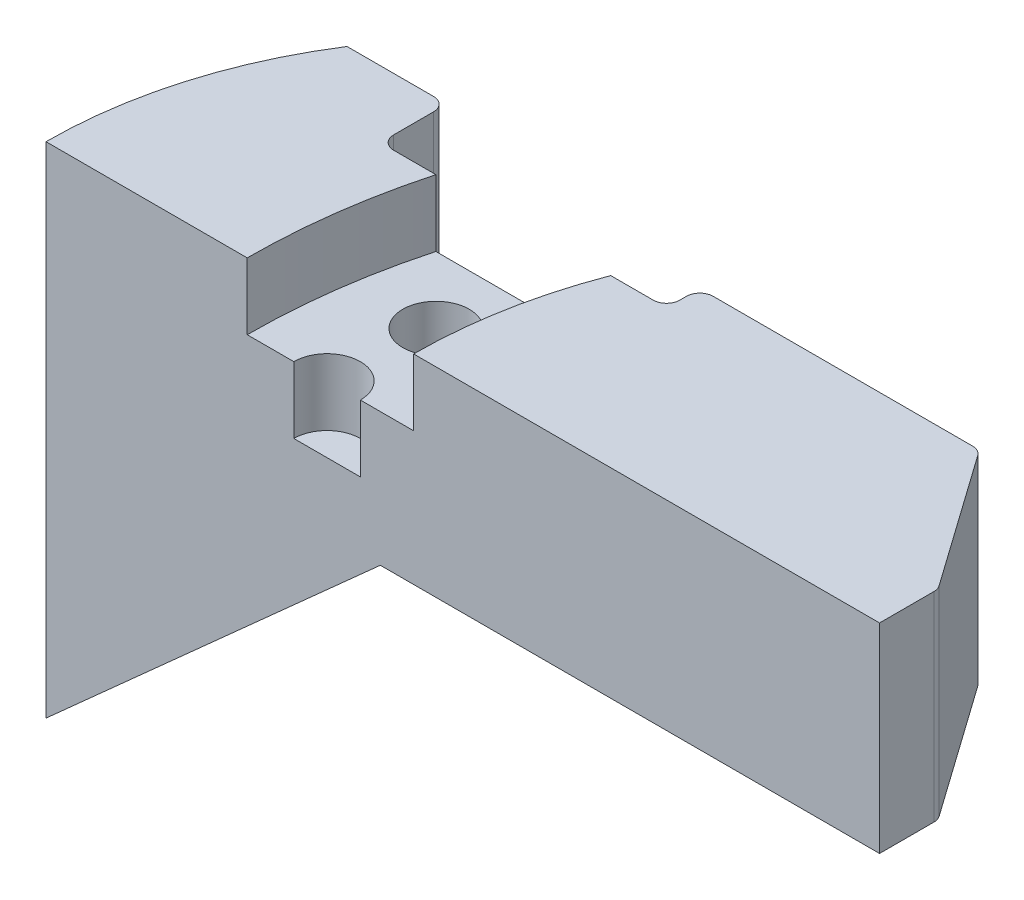
ISO-10303-21;
HEADER;
FILE_DESCRIPTION(('STEP AP214'),'2;1');
FILE_NAME('part.step','',(''),(''),'','','');
FILE_SCHEMA(('AUTOMOTIVE_DESIGN { 1 0 10303 214 1 1 1 1 }'));
ENDSEC;
DATA;
#1=APPLICATION_CONTEXT('core data for automotive mechanical design processes');
#2=APPLICATION_PROTOCOL_DEFINITION('international standard','automotive_design',2000,#1);
#3=PRODUCT_CONTEXT('',#1,'mechanical');
#4=PRODUCT('Part','Part','',(#3));
#5=PRODUCT_RELATED_PRODUCT_CATEGORY('part','',(#4));
#6=PRODUCT_DEFINITION_FORMATION('','',#4);
#7=PRODUCT_DEFINITION_CONTEXT('part definition',#1,'design');
#8=PRODUCT_DEFINITION('design','',#6,#7);
#9=PRODUCT_DEFINITION_SHAPE('','',#8);
#10=(LENGTH_UNIT() NAMED_UNIT(*) SI_UNIT(.MILLI.,.METRE.));
#11=(NAMED_UNIT(*) PLANE_ANGLE_UNIT() SI_UNIT($,.RADIAN.));
#12=(NAMED_UNIT(*) SI_UNIT($,.STERADIAN.) SOLID_ANGLE_UNIT());
#13=UNCERTAINTY_MEASURE_WITH_UNIT(LENGTH_MEASURE(1.E-05),#10,'distance_accuracy_value','');
#14=(GEOMETRIC_REPRESENTATION_CONTEXT(3) GLOBAL_UNCERTAINTY_ASSIGNED_CONTEXT((#13)) GLOBAL_UNIT_ASSIGNED_CONTEXT((#10,
#11,#12)) REPRESENTATION_CONTEXT('',''));
#15=CARTESIAN_POINT('',(0.,0.,0.));
#16=DIRECTION('',(0.,0.,1.));
#17=DIRECTION('',(1.,0.,0.));
#18=AXIS2_PLACEMENT_3D('',#15,#16,#17);
#19=CARTESIAN_POINT('',(-45.,75.,-33.));
#20=DIRECTION('',(0.,1.,0.));
#21=DIRECTION('',(0.,0.,1.));
#22=AXIS2_PLACEMENT_3D('',#19,#20,#21);
#23=PLANE('',#22);
#24=DIRECTION('',(-1.,0.,0.));
#25=VECTOR('',#24,1.);
#26=CARTESIAN_POINT('',(-2.00000000000001,75.,-25.));
#27=LINE('',#26,#25);
#28=CARTESIAN_POINT('',(-2.00000000000001,75.,-25.));
#29=VERTEX_POINT('',#28);
#30=CARTESIAN_POINT('',(-8.38348415311009,75.,-25.));
#31=VERTEX_POINT('',#30);
#32=EDGE_CURVE('E331',#29,#31,#27,.T.);
#33=ORIENTED_EDGE('',*,*,#32,.T.);
#34=CARTESIAN_POINT('',(57.,75.,0.));
#35=DIRECTION('',(0.,1.,0.));
#36=DIRECTION('',(0.,0.,1.));
#37=AXIS2_PLACEMENT_3D('',#34,#35,#36);
#38=CIRCLE('',#37,70.);
#39=CARTESIAN_POINT('',(-13.,75.,0.));
#40=VERTEX_POINT('',#39);
#41=EDGE_CURVE('E285',#31,#40,#38,.T.);
#42=ORIENTED_EDGE('',*,*,#41,.T.);
#43=DIRECTION('',(1.,0.,0.));
#44=VECTOR('',#43,1.);
#45=CARTESIAN_POINT('',(-58.,75.,0.));
#46=LINE('',#45,#44);
#47=CARTESIAN_POINT('',(57.,75.,0.));
#48=VERTEX_POINT('',#47);
#49=EDGE_CURVE('E312',#40,#48,#46,.T.);
#50=ORIENTED_EDGE('',*,*,#49,.T.);
#51=DIRECTION('',(0.,0.,-1.));
#52=VECTOR('',#51,1.);
#53=CARTESIAN_POINT('',(57.,75.,0.));
#54=LINE('',#53,#52);
#55=CARTESIAN_POINT('',(57.,75.,-8.15891819445376));
#56=VERTEX_POINT('',#55);
#57=EDGE_CURVE('E229',#48,#56,#54,.T.);
#58=ORIENTED_EDGE('',*,*,#57,.T.);
#59=CARTESIAN_POINT('',(55.,75.,-8.15891819445377));
#60=DIRECTION('',(0.,1.,0.));
#61=DIRECTION('',(0.,0.,1.));
#62=AXIS2_PLACEMENT_3D('',#59,#60,#61);
#63=CIRCLE('',#62,2.);
#64=CARTESIAN_POINT('',(56.6327880172232,75.,-9.31390879649877));
#65=VERTEX_POINT('',#64);
#66=EDGE_CURVE('E316',#56,#65,#63,.T.);
#67=ORIENTED_EDGE('',*,*,#66,.T.);
#68=DIRECTION('',(-0.577495301022498,0.,-0.81639400861161));
#69=VECTOR('',#68,1.);
#70=CARTESIAN_POINT('',(56.6327880172232,75.,-9.31390879649877));
#71=LINE('',#70,#69);
#72=CARTESIAN_POINT('',(42.5977370626087,75.,-29.154990602045));
#73=VERTEX_POINT('',#72);
#74=EDGE_CURVE('E318',#65,#73,#71,.T.);
#75=ORIENTED_EDGE('',*,*,#74,.T.);
#76=CARTESIAN_POINT('',(40.9649490453855,75.,-28.));
#77=DIRECTION('',(0.,1.,0.));
#78=DIRECTION('',(0.,0.,1.));
#79=AXIS2_PLACEMENT_3D('',#76,#77,#78);
#80=CIRCLE('',#79,2.);
#81=CARTESIAN_POINT('',(40.9649490453855,75.,-30.));
#82=VERTEX_POINT('',#81);
#83=EDGE_CURVE('E320',#73,#82,#80,.T.);
#84=ORIENTED_EDGE('',*,*,#83,.T.);
#85=DIRECTION('',(-1.,0.,0.));
#86=VECTOR('',#85,1.);
#87=CARTESIAN_POINT('',(40.9649490453855,75.,-30.));
#88=LINE('',#87,#86);
#89=CARTESIAN_POINT('',(2.00000000000001,75.,-30.));
#90=VERTEX_POINT('',#89);
#91=EDGE_CURVE('E322',#82,#90,#88,.T.);
#92=ORIENTED_EDGE('',*,*,#91,.T.);
#93=CARTESIAN_POINT('',(2.,75.,-28.));
#94=DIRECTION('',(0.,1.,0.));
#95=DIRECTION('',(0.,0.,1.));
#96=AXIS2_PLACEMENT_3D('',#93,#94,#95);
#97=CIRCLE('',#96,2.);
#98=CARTESIAN_POINT('',(0.,75.,-28.));
#99=VERTEX_POINT('',#98);
#100=EDGE_CURVE('E324',#90,#99,#97,.T.);
#101=ORIENTED_EDGE('',*,*,#100,.T.);
#102=DIRECTION('',(0.,0.,1.));
#103=VECTOR('',#102,1.);
#104=CARTESIAN_POINT('',(0.,75.,-28.));
#105=LINE('',#104,#103);
#106=CARTESIAN_POINT('',(0.,75.,-27.));
#107=VERTEX_POINT('',#106);
#108=EDGE_CURVE('E326',#99,#107,#105,.T.);
#109=ORIENTED_EDGE('',*,*,#108,.T.);
#110=CARTESIAN_POINT('',(-2.,75.,-27.));
#111=DIRECTION('',(0.,-1.,0.));
#112=DIRECTION('',(0.,0.,1.));
#113=AXIS2_PLACEMENT_3D('',#110,#111,#112);
#114=CIRCLE('',#113,2.);
#115=EDGE_CURVE('E328',#107,#29,#114,.T.);
#116=ORIENTED_EDGE('',*,*,#115,.T.);
#117=EDGE_LOOP('',(#33,#42,#50,#58,#67,#75,#84,#92,#101,#109,#116));
#118=FACE_BOUND('',#117,.T.);
#119=ADVANCED_FACE('F53',(#118),#23,.T.);
#120=CARTESIAN_POINT('',(-45.,75.,-33.));
#121=DIRECTION('',(0.,-1.,0.));
#122=DIRECTION('',(0.,0.,-1.));
#123=AXIS2_PLACEMENT_3D('',#120,#121,#122);
#124=CYLINDRICAL_SURFACE('',#123,2.);
#125=DIRECTION('',(0.,-1.,0.));
#126=VECTOR('',#125,1.);
#127=CARTESIAN_POINT('',(-43.,75.,-33.));
#128=LINE('',#127,#126);
#129=CARTESIAN_POINT('',(-43.,75.,-33.));
#130=VERTEX_POINT('',#129);
#131=CARTESIAN_POINT('',(-43.,22.6020202218902,-33.));
#132=VERTEX_POINT('',#131);
#133=EDGE_CURVE('E338',#130,#132,#128,.T.);
#134=ORIENTED_EDGE('',*,*,#133,.T.);
#135=CARTESIAN_POINT('',(-45.,20.8101818396414,-33.));
#136=DIRECTION('',(-0.667283797428639,0.744803553757106,0.));
#137=DIRECTION('',(-0.744803553757106,-0.667283797428639,0.));
#138=AXIS2_PLACEMENT_3D('',#135,#136,#137);
#139=ELLIPSE('',#138,2.68527182759957,2.);
#140=CARTESIAN_POINT('',(-45.,20.8101818396414,-35.));
#141=VERTEX_POINT('',#140);
#142=EDGE_CURVE('E409',#132,#141,#139,.T.);
#143=ORIENTED_EDGE('',*,*,#142,.T.);
#144=DIRECTION('',(0.,-1.,0.));
#145=VECTOR('',#144,1.);
#146=CARTESIAN_POINT('',(-45.,75.,-35.));
#147=LINE('',#146,#145);
#148=CARTESIAN_POINT('',(-45.,75.,-35.));
#149=VERTEX_POINT('',#148);
#150=EDGE_CURVE('E234',#149,#141,#147,.T.);
#151=ORIENTED_EDGE('',*,*,#150,.F.);
#152=CARTESIAN_POINT('',(-45.,75.,-33.));
#153=DIRECTION('',(0.,1.,0.));
#154=DIRECTION('',(0.,0.,1.));
#155=AXIS2_PLACEMENT_3D('',#152,#153,#154);
#156=CIRCLE('',#155,2.);
#157=EDGE_CURVE('E307',#130,#149,#156,.T.);
#158=ORIENTED_EDGE('',*,*,#157,.F.);
#159=EDGE_LOOP('',(#134,#143,#151,#158));
#160=FACE_BOUND('',#159,.T.);
#161=ADVANCED_FACE('F55',(#160),#124,.T.);
#162=CARTESIAN_POINT('',(-45.,75.,-35.));
#163=DIRECTION('',(0.,0.,1.));
#164=DIRECTION('',(1.,0.,0.));
#165=AXIS2_PLACEMENT_3D('',#162,#163,#164);
#166=PLANE('',#165);
#167=ORIENTED_EDGE('',*,*,#150,.T.);
#168=DIRECTION('',(-0.744803553757106,-0.667283797428639,0.));
#169=VECTOR('',#168,1.);
#170=CARTESIAN_POINT('',(-68.2277442494834,0.,-35.));
#171=LINE('',#170,#169);
#172=CARTESIAN_POINT('',(-58.,9.16323235502432,-35.));
#173=VERTEX_POINT('',#172);
#174=EDGE_CURVE('E217',#141,#173,#171,.T.);
#175=ORIENTED_EDGE('',*,*,#174,.T.);
#176=DIRECTION('',(0.,-1.,0.));
#177=VECTOR('',#176,1.);
#178=CARTESIAN_POINT('',(-58.,75.,-35.));
#179=LINE('',#178,#177);
#180=CARTESIAN_POINT('',(-58.,75.,-35.));
#181=VERTEX_POINT('',#180);
#182=EDGE_CURVE('E230',#181,#173,#179,.T.);
#183=ORIENTED_EDGE('',*,*,#182,.F.);
#184=DIRECTION('',(-1.,0.,0.));
#185=VECTOR('',#184,1.);
#186=CARTESIAN_POINT('',(-45.,75.,-35.));
#187=LINE('',#186,#185);
#188=EDGE_CURVE('E310',#149,#181,#187,.T.);
#189=ORIENTED_EDGE('',*,*,#188,.F.);
#190=EDGE_LOOP('',(#167,#175,#183,#189));
#191=FACE_BOUND('',#190,.T.);
#192=ADVANCED_FACE('F254',(#191),#166,.F.);
#193=CARTESIAN_POINT('',(-58.,75.,0.));
#194=DIRECTION('',(0.,0.,-1.));
#195=DIRECTION('',(-1.,0.,0.));
#196=AXIS2_PLACEMENT_3D('',#193,#194,#195);
#197=PLANE('',#196);
#198=DIRECTION('',(0.,1.,0.));
#199=VECTOR('',#198,1.);
#200=CARTESIAN_POINT('',(-68.2277442494834,0.,0.));
#201=LINE('',#200,#199);
#202=CARTESIAN_POINT('',(-68.2277442494834,0.,0.));
#203=VERTEX_POINT('',#202);
#204=CARTESIAN_POINT('',(-68.2277442494834,75.,0.));
#205=VERTEX_POINT('',#204);
#206=EDGE_CURVE('E261',#203,#205,#201,.T.);
#207=ORIENTED_EDGE('',*,*,#206,.F.);
#208=DIRECTION('',(-0.744803553757106,-0.667283797428639,0.));
#209=VECTOR('',#208,1.);
#210=CARTESIAN_POINT('',(-68.2277442494834,0.,0.));
#211=LINE('',#210,#209);
#212=CARTESIAN_POINT('',(-18.,45.,0.));
#213=VERTEX_POINT('',#212);
#214=EDGE_CURVE('E226',#213,#203,#211,.T.);
#215=ORIENTED_EDGE('',*,*,#214,.F.);
#216=DIRECTION('',(-1.,0.,0.));
#217=VECTOR('',#216,1.);
#218=CARTESIAN_POINT('',(-18.,45.,0.));
#219=LINE('',#218,#217);
#220=CARTESIAN_POINT('',(57.,45.,0.));
#221=VERTEX_POINT('',#220);
#222=EDGE_CURVE('E208',#221,#213,#219,.T.);
#223=ORIENTED_EDGE('',*,*,#222,.F.);
#224=DIRECTION('',(0.,-1.,0.));
#225=VECTOR('',#224,1.);
#226=CARTESIAN_POINT('',(57.,75.,0.));
#227=LINE('',#226,#225);
#228=EDGE_CURVE('E224',#48,#221,#227,.T.);
#229=ORIENTED_EDGE('',*,*,#228,.F.);
#230=ORIENTED_EDGE('',*,*,#49,.F.);
#231=DIRECTION('',(0.,1.,0.));
#232=VECTOR('',#231,1.);
#233=CARTESIAN_POINT('',(-13.,65.,0.));
#234=LINE('',#233,#232);
#235=CARTESIAN_POINT('',(-13.,65.,0.));
#236=VERTEX_POINT('',#235);
#237=EDGE_CURVE('E76',#236,#40,#234,.T.);
#238=ORIENTED_EDGE('',*,*,#237,.F.);
#239=DIRECTION('',(1.,0.,0.));
#240=VECTOR('',#239,1.);
#241=CARTESIAN_POINT('',(-58.,65.,0.));
#242=LINE('',#241,#240);
#243=CARTESIAN_POINT('',(-21.,65.,0.));
#244=VERTEX_POINT('',#243);
#245=EDGE_CURVE('E303',#244,#236,#242,.T.);
#246=ORIENTED_EDGE('',*,*,#245,.F.);
#247=DIRECTION('',(0.,1.,0.));
#248=VECTOR('',#247,1.);
#249=CARTESIAN_POINT('',(-21.,55.,0.));
#250=LINE('',#249,#248);
#251=CARTESIAN_POINT('',(-21.,55.,0.));
#252=VERTEX_POINT('',#251);
#253=EDGE_CURVE('E68',#244,#252,#250,.F.);
#254=ORIENTED_EDGE('',*,*,#253,.T.);
#255=DIRECTION('',(1.,0.,0.));
#256=VECTOR('',#255,1.);
#257=CARTESIAN_POINT('',(-58.,55.,0.));
#258=LINE('',#257,#256);
#259=CARTESIAN_POINT('',(-31.,55.,0.));
#260=VERTEX_POINT('',#259);
#261=EDGE_CURVE('E244',#260,#252,#258,.T.);
#262=ORIENTED_EDGE('',*,*,#261,.F.);
#263=DIRECTION('',(0.,1.,0.));
#264=VECTOR('',#263,1.);
#265=CARTESIAN_POINT('',(-31.,55.,0.));
#266=LINE('',#265,#264);
#267=CARTESIAN_POINT('',(-31.,65.,0.));
#268=VERTEX_POINT('',#267);
#269=EDGE_CURVE('E282',#260,#268,#266,.T.);
#270=ORIENTED_EDGE('',*,*,#269,.T.);
#271=CARTESIAN_POINT('',(-38.,65.,0.));
#272=VERTEX_POINT('',#271);
#273=EDGE_CURVE('E304',#272,#268,#242,.T.);
#274=ORIENTED_EDGE('',*,*,#273,.F.);
#275=DIRECTION('',(0.,1.,0.));
#276=VECTOR('',#275,1.);
#277=CARTESIAN_POINT('',(-38.,65.,0.));
#278=LINE('',#277,#276);
#279=CARTESIAN_POINT('',(-38.,75.,0.));
#280=VERTEX_POINT('',#279);
#281=EDGE_CURVE('E300',#272,#280,#278,.T.);
#282=ORIENTED_EDGE('',*,*,#281,.T.);
#283=EDGE_CURVE('E313',#205,#280,#46,.T.);
#284=ORIENTED_EDGE('',*,*,#283,.F.);
#285=EDGE_LOOP('',(#207,#215,#223,#229,#230,#238,#246,#254,#262,#270,#274,#282,#284));
#286=FACE_BOUND('',#285,.T.);
#287=ADVANCED_FACE('F222',(#286),#197,.F.);
#288=CARTESIAN_POINT('',(57.,75.,0.));
#289=DIRECTION('',(-1.,0.,0.));
#290=DIRECTION('',(0.,0.,1.));
#291=AXIS2_PLACEMENT_3D('',#288,#289,#290);
#292=PLANE('',#291);
#293=ORIENTED_EDGE('',*,*,#228,.T.);
#294=DIRECTION('',(0.,0.,1.));
#295=VECTOR('',#294,1.);
#296=CARTESIAN_POINT('',(57.,45.,-35.));
#297=LINE('',#296,#295);
#298=CARTESIAN_POINT('',(57.,45.,-8.15891819445377));
#299=VERTEX_POINT('',#298);
#300=EDGE_CURVE('E204',#299,#221,#297,.T.);
#301=ORIENTED_EDGE('',*,*,#300,.F.);
#302=DIRECTION('',(0.,-1.,0.));
#303=VECTOR('',#302,1.);
#304=CARTESIAN_POINT('',(57.,75.,-8.15891819445376));
#305=LINE('',#304,#303);
#306=EDGE_CURVE('E231',#56,#299,#305,.T.);
#307=ORIENTED_EDGE('',*,*,#306,.F.);
#308=ORIENTED_EDGE('',*,*,#57,.F.);
#309=EDGE_LOOP('',(#293,#301,#307,#308));
#310=FACE_BOUND('',#309,.T.);
#311=ADVANCED_FACE('F228',(#310),#292,.F.);
#312=CARTESIAN_POINT('',(55.,75.,-8.15891819445377));
#313=DIRECTION('',(0.,-1.,0.));
#314=DIRECTION('',(0.,0.,-1.));
#315=AXIS2_PLACEMENT_3D('',#312,#313,#314);
#316=CYLINDRICAL_SURFACE('',#315,2.);
#317=ORIENTED_EDGE('',*,*,#306,.T.);
#318=CARTESIAN_POINT('',(55.,45.,-8.15891819445377));
#319=DIRECTION('',(0.,1.,0.));
#320=DIRECTION('',(0.,0.,1.));
#321=AXIS2_PLACEMENT_3D('',#318,#319,#320);
#322=CIRCLE('',#321,2.);
#323=CARTESIAN_POINT('',(56.6327880172232,45.,-9.31390879649877));
#324=VERTEX_POINT('',#323);
#325=EDGE_CURVE('E211',#299,#324,#322,.T.);
#326=ORIENTED_EDGE('',*,*,#325,.T.);
#327=DIRECTION('',(0.,-1.,0.));
#328=VECTOR('',#327,1.);
#329=CARTESIAN_POINT('',(56.6327880172232,75.,-9.31390879649877));
#330=LINE('',#329,#328);
#331=EDGE_CURVE('E236',#65,#324,#330,.T.);
#332=ORIENTED_EDGE('',*,*,#331,.F.);
#333=ORIENTED_EDGE('',*,*,#66,.F.);
#334=EDGE_LOOP('',(#317,#326,#332,#333));
#335=FACE_BOUND('',#334,.T.);
#336=ADVANCED_FACE('F373',(#335),#316,.T.);
#337=CARTESIAN_POINT('',(56.6327880172232,75.,-9.31390879649877));
#338=DIRECTION('',(-0.81639400861161,0.,0.577495301022498));
#339=DIRECTION('',(0.577495301022498,0.,0.81639400861161));
#340=AXIS2_PLACEMENT_3D('',#337,#338,#339);
#341=PLANE('',#340);
#342=ORIENTED_EDGE('',*,*,#331,.T.);
#343=DIRECTION('',(-0.577495301022498,0.,-0.81639400861161));
#344=VECTOR('',#343,1.);
#345=CARTESIAN_POINT('',(56.6327880172232,45.,-9.31390879649877));
#346=LINE('',#345,#344);
#347=CARTESIAN_POINT('',(42.5977370626087,45.,-29.154990602045));
#348=VERTEX_POINT('',#347);
#349=EDGE_CURVE('E267',#324,#348,#346,.T.);
#350=ORIENTED_EDGE('',*,*,#349,.T.);
#351=DIRECTION('',(0.,-1.,0.));
#352=VECTOR('',#351,1.);
#353=CARTESIAN_POINT('',(42.5977370626087,75.,-29.154990602045));
#354=LINE('',#353,#352);
#355=EDGE_CURVE('E362',#73,#348,#354,.T.);
#356=ORIENTED_EDGE('',*,*,#355,.F.);
#357=ORIENTED_EDGE('',*,*,#74,.F.);
#358=EDGE_LOOP('',(#342,#350,#356,#357));
#359=FACE_BOUND('',#358,.T.);
#360=ADVANCED_FACE('F369',(#359),#341,.F.);
#361=CARTESIAN_POINT('',(40.9649490453855,75.,-28.));
#362=DIRECTION('',(0.,-1.,0.));
#363=DIRECTION('',(0.,0.,-1.));
#364=AXIS2_PLACEMENT_3D('',#361,#362,#363);
#365=CYLINDRICAL_SURFACE('',#364,2.);
#366=ORIENTED_EDGE('',*,*,#355,.T.);
#367=CARTESIAN_POINT('',(40.9649490453855,45.,-28.));
#368=DIRECTION('',(0.,1.,0.));
#369=DIRECTION('',(0.,0.,1.));
#370=AXIS2_PLACEMENT_3D('',#367,#368,#369);
#371=CIRCLE('',#370,2.);
#372=CARTESIAN_POINT('',(40.9649490453855,45.,-30.));
#373=VERTEX_POINT('',#372);
#374=EDGE_CURVE('E420',#348,#373,#371,.T.);
#375=ORIENTED_EDGE('',*,*,#374,.T.);
#376=DIRECTION('',(0.,-1.,0.));
#377=VECTOR('',#376,1.);
#378=CARTESIAN_POINT('',(40.9649490453855,75.,-30.));
#379=LINE('',#378,#377);
#380=EDGE_CURVE('E359',#82,#373,#379,.T.);
#381=ORIENTED_EDGE('',*,*,#380,.F.);
#382=ORIENTED_EDGE('',*,*,#83,.F.);
#383=EDGE_LOOP('',(#366,#375,#381,#382));
#384=FACE_BOUND('',#383,.T.);
#385=ADVANCED_FACE('F424',(#384),#365,.T.);
#386=CARTESIAN_POINT('',(40.9649490453855,75.,-30.));
#387=DIRECTION('',(0.,0.,1.));
#388=DIRECTION('',(1.,0.,0.));
#389=AXIS2_PLACEMENT_3D('',#386,#387,#388);
#390=PLANE('',#389);
#391=ORIENTED_EDGE('',*,*,#380,.T.);
#392=DIRECTION('',(-1.,0.,0.));
#393=VECTOR('',#392,1.);
#394=CARTESIAN_POINT('',(40.9649490453855,45.,-30.));
#395=LINE('',#394,#393);
#396=CARTESIAN_POINT('',(2.00000000000001,45.,-30.));
#397=VERTEX_POINT('',#396);
#398=EDGE_CURVE('E417',#373,#397,#395,.T.);
#399=ORIENTED_EDGE('',*,*,#398,.T.);
#400=DIRECTION('',(0.,-1.,0.));
#401=VECTOR('',#400,1.);
#402=CARTESIAN_POINT('',(2.00000000000001,75.,-30.));
#403=LINE('',#402,#401);
#404=EDGE_CURVE('E356',#90,#397,#403,.T.);
#405=ORIENTED_EDGE('',*,*,#404,.F.);
#406=ORIENTED_EDGE('',*,*,#91,.F.);
#407=EDGE_LOOP('',(#391,#399,#405,#406));
#408=FACE_BOUND('',#407,.T.);
#409=ADVANCED_FACE('F428',(#408),#390,.F.);
#410=CARTESIAN_POINT('',(2.,75.,-28.));
#411=DIRECTION('',(0.,-1.,0.));
#412=DIRECTION('',(0.,0.,-1.));
#413=AXIS2_PLACEMENT_3D('',#410,#411,#412);
#414=CYLINDRICAL_SURFACE('',#413,2.);
#415=ORIENTED_EDGE('',*,*,#404,.T.);
#416=CARTESIAN_POINT('',(2.,45.,-28.));
#417=DIRECTION('',(0.,1.,0.));
#418=DIRECTION('',(0.,0.,1.));
#419=AXIS2_PLACEMENT_3D('',#416,#417,#418);
#420=CIRCLE('',#419,2.);
#421=CARTESIAN_POINT('',(0.,45.,-28.));
#422=VERTEX_POINT('',#421);
#423=EDGE_CURVE('E414',#397,#422,#420,.T.);
#424=ORIENTED_EDGE('',*,*,#423,.T.);
#425=DIRECTION('',(0.,-1.,0.));
#426=VECTOR('',#425,1.);
#427=CARTESIAN_POINT('',(0.,75.,-28.));
#428=LINE('',#427,#426);
#429=EDGE_CURVE('E353',#99,#422,#428,.T.);
#430=ORIENTED_EDGE('',*,*,#429,.F.);
#431=ORIENTED_EDGE('',*,*,#100,.F.);
#432=EDGE_LOOP('',(#415,#424,#430,#431));
#433=FACE_BOUND('',#432,.T.);
#434=ADVANCED_FACE('F433',(#433),#414,.T.);
#435=CARTESIAN_POINT('',(0.,75.,-28.));
#436=DIRECTION('',(1.,0.,0.));
#437=DIRECTION('',(0.,0.,-1.));
#438=AXIS2_PLACEMENT_3D('',#435,#436,#437);
#439=PLANE('',#438);
#440=ORIENTED_EDGE('',*,*,#429,.T.);
#441=DIRECTION('',(0.,0.,1.));
#442=VECTOR('',#441,1.);
#443=CARTESIAN_POINT('',(0.,45.,-28.));
#444=LINE('',#443,#442);
#445=CARTESIAN_POINT('',(0.,45.,-27.));
#446=VERTEX_POINT('',#445);
#447=EDGE_CURVE('E412',#422,#446,#444,.T.);
#448=ORIENTED_EDGE('',*,*,#447,.T.);
#449=DIRECTION('',(0.,-1.,0.));
#450=VECTOR('',#449,1.);
#451=CARTESIAN_POINT('',(0.,75.,-27.));
#452=LINE('',#451,#450);
#453=EDGE_CURVE('E350',#107,#446,#452,.T.);
#454=ORIENTED_EDGE('',*,*,#453,.F.);
#455=ORIENTED_EDGE('',*,*,#108,.F.);
#456=EDGE_LOOP('',(#440,#448,#454,#455));
#457=FACE_BOUND('',#456,.T.);
#458=ADVANCED_FACE('F435',(#457),#439,.F.);
#459=CARTESIAN_POINT('',(-2.,75.,-27.));
#460=DIRECTION('',(0.,-1.,0.));
#461=DIRECTION('',(0.,0.,-1.));
#462=AXIS2_PLACEMENT_3D('',#459,#460,#461);
#463=CYLINDRICAL_SURFACE('',#462,2.);
#464=ORIENTED_EDGE('',*,*,#453,.T.);
#465=CARTESIAN_POINT('',(-2.,45.,-27.));
#466=DIRECTION('',(0.,1.,0.));
#467=DIRECTION('',(0.,0.,1.));
#468=AXIS2_PLACEMENT_3D('',#465,#466,#467);
#469=CIRCLE('',#468,2.);
#470=CARTESIAN_POINT('',(-2.00000000000001,45.,-25.));
#471=VERTEX_POINT('',#470);
#472=EDGE_CURVE('E394',#446,#471,#469,.F.);
#473=ORIENTED_EDGE('',*,*,#472,.T.);
#474=DIRECTION('',(0.,-1.,0.));
#475=VECTOR('',#474,1.);
#476=CARTESIAN_POINT('',(-2.00000000000001,75.,-25.));
#477=LINE('',#476,#475);
#478=EDGE_CURVE('E347',#29,#471,#477,.T.);
#479=ORIENTED_EDGE('',*,*,#478,.F.);
#480=ORIENTED_EDGE('',*,*,#115,.F.);
#481=EDGE_LOOP('',(#464,#473,#479,#480));
#482=FACE_BOUND('',#481,.T.);
#483=ADVANCED_FACE('F393',(#482),#463,.F.);
#484=CARTESIAN_POINT('',(-2.00000000000001,75.,-25.));
#485=DIRECTION('',(0.,0.,1.));
#486=DIRECTION('',(1.,0.,0.));
#487=AXIS2_PLACEMENT_3D('',#484,#485,#486);
#488=PLANE('',#487);
#489=DIRECTION('',(-1.,0.,0.));
#490=VECTOR('',#489,1.);
#491=CARTESIAN_POINT('',(-2.00000000000001,45.,-25.));
#492=LINE('',#491,#490);
#493=CARTESIAN_POINT('',(-18.,45.,-25.));
#494=VERTEX_POINT('',#493);
#495=EDGE_CURVE('E12',#471,#494,#492,.T.);
#496=ORIENTED_EDGE('',*,*,#495,.T.);
#497=DIRECTION('',(-0.744803553757106,-0.667283797428639,0.));
#498=VECTOR('',#497,1.);
#499=CARTESIAN_POINT('',(5.78557764970905,66.3099554883538,-25.));
#500=LINE('',#499,#498);
#501=CARTESIAN_POINT('',(-41.,24.393858604139,-25.));
#502=VERTEX_POINT('',#501);
#503=EDGE_CURVE('E397',#494,#502,#500,.T.);
#504=ORIENTED_EDGE('',*,*,#503,.T.);
#505=DIRECTION('',(0.,-1.,0.));
#506=VECTOR('',#505,1.);
#507=CARTESIAN_POINT('',(-41.,75.,-25.));
#508=LINE('',#507,#506);
#509=CARTESIAN_POINT('',(-41.,75.,-25.));
#510=VERTEX_POINT('',#509);
#511=EDGE_CURVE('E344',#510,#502,#508,.T.);
#512=ORIENTED_EDGE('',*,*,#511,.F.);
#513=CARTESIAN_POINT('',(-34.6515138991168,75.,-25.));
#514=VERTEX_POINT('',#513);
#515=EDGE_CURVE('E330',#514,#510,#27,.T.);
#516=ORIENTED_EDGE('',*,*,#515,.F.);
#517=DIRECTION('',(0.,1.,0.));
#518=VECTOR('',#517,1.);
#519=CARTESIAN_POINT('',(-34.6515138991168,65.,-25.));
#520=LINE('',#519,#518);
#521=CARTESIAN_POINT('',(-34.6515138991168,65.,-25.));
#522=VERTEX_POINT('',#521);
#523=EDGE_CURVE('E297',#514,#522,#520,.F.);
#524=ORIENTED_EDGE('',*,*,#523,.T.);
#525=DIRECTION('',(-1.,0.,0.));
#526=VECTOR('',#525,1.);
#527=CARTESIAN_POINT('',(-2.00000000000001,65.,-25.));
#528=LINE('',#527,#526);
#529=CARTESIAN_POINT('',(-8.38348415311009,65.,-25.));
#530=VERTEX_POINT('',#529);
#531=EDGE_CURVE('E242',#530,#522,#528,.T.);
#532=ORIENTED_EDGE('',*,*,#531,.F.);
#533=DIRECTION('',(0.,1.,0.));
#534=VECTOR('',#533,1.);
#535=CARTESIAN_POINT('',(-8.38348415311008,65.,-25.));
#536=LINE('',#535,#534);
#537=EDGE_CURVE('E293',#31,#530,#536,.F.);
#538=ORIENTED_EDGE('',*,*,#537,.F.);
#539=ORIENTED_EDGE('',*,*,#32,.F.);
#540=ORIENTED_EDGE('',*,*,#478,.T.);
#541=EDGE_LOOP('',(#496,#504,#512,#516,#524,#532,#538,#539,#540));
#542=FACE_BOUND('',#541,.T.);
#543=ADVANCED_FACE('F386',(#542),#488,.F.);
#544=CARTESIAN_POINT('',(-41.,75.,-27.));
#545=DIRECTION('',(0.,-1.,0.));
#546=DIRECTION('',(0.,0.,-1.));
#547=AXIS2_PLACEMENT_3D('',#544,#545,#546);
#548=CYLINDRICAL_SURFACE('',#547,2.);
#549=ORIENTED_EDGE('',*,*,#511,.T.);
#550=CARTESIAN_POINT('',(-41.,24.393858604139,-27.));
#551=DIRECTION('',(-0.667283797428639,0.744803553757106,0.));
#552=DIRECTION('',(-0.744803553757106,-0.667283797428639,0.));
#553=AXIS2_PLACEMENT_3D('',#550,#551,#552);
#554=ELLIPSE('',#553,2.68527182759957,2.);
#555=CARTESIAN_POINT('',(-43.,22.6020202218902,-27.));
#556=VERTEX_POINT('',#555);
#557=EDGE_CURVE('E402',#502,#556,#554,.F.);
#558=ORIENTED_EDGE('',*,*,#557,.T.);
#559=DIRECTION('',(0.,-1.,0.));
#560=VECTOR('',#559,1.);
#561=CARTESIAN_POINT('',(-43.,75.,-27.));
#562=LINE('',#561,#560);
#563=CARTESIAN_POINT('',(-43.,75.,-27.));
#564=VERTEX_POINT('',#563);
#565=EDGE_CURVE('E341',#564,#556,#562,.T.);
#566=ORIENTED_EDGE('',*,*,#565,.F.);
#567=CARTESIAN_POINT('',(-41.,75.,-27.));
#568=DIRECTION('',(0.,-1.,0.));
#569=DIRECTION('',(0.,0.,1.));
#570=AXIS2_PLACEMENT_3D('',#567,#568,#569);
#571=CIRCLE('',#570,2.);
#572=EDGE_CURVE('E334',#510,#564,#571,.T.);
#573=ORIENTED_EDGE('',*,*,#572,.F.);
#574=EDGE_LOOP('',(#549,#558,#566,#573));
#575=FACE_BOUND('',#574,.T.);
#576=ADVANCED_FACE('F463',(#575),#548,.F.);
#577=CARTESIAN_POINT('',(-43.,75.,-27.));
#578=DIRECTION('',(-1.,0.,0.));
#579=DIRECTION('',(0.,0.,1.));
#580=AXIS2_PLACEMENT_3D('',#577,#578,#579);
#581=PLANE('',#580);
#582=ORIENTED_EDGE('',*,*,#565,.T.);
#583=DIRECTION('',(0.,0.,-1.));
#584=VECTOR('',#583,1.);
#585=CARTESIAN_POINT('',(-43.,22.6020202218902,-27.));
#586=LINE('',#585,#584);
#587=EDGE_CURVE('E399',#556,#132,#586,.T.);
#588=ORIENTED_EDGE('',*,*,#587,.T.);
#589=ORIENTED_EDGE('',*,*,#133,.F.);
#590=DIRECTION('',(0.,0.,-1.));
#591=VECTOR('',#590,1.);
#592=CARTESIAN_POINT('',(-43.,75.,-27.));
#593=LINE('',#592,#591);
#594=EDGE_CURVE('E336',#564,#130,#593,.T.);
#595=ORIENTED_EDGE('',*,*,#594,.F.);
#596=EDGE_LOOP('',(#582,#588,#589,#595));
#597=FACE_BOUND('',#596,.T.);
#598=ADVANCED_FACE('F455',(#597),#581,.F.);
#599=CARTESIAN_POINT('',(57.,75.,0.));
#600=DIRECTION('',(0.,1.,0.));
#601=DIRECTION('',(0.,0.,1.));
#602=AXIS2_PLACEMENT_3D('',#599,#600,#601);
#603=CIRCLE('',#602,95.);
#604=EDGE_CURVE('E288',#514,#280,#603,.T.);
#605=ORIENTED_EDGE('',*,*,#604,.F.);
#606=ORIENTED_EDGE('',*,*,#515,.T.);
#607=ORIENTED_EDGE('',*,*,#572,.T.);
#608=ORIENTED_EDGE('',*,*,#594,.T.);
#609=ORIENTED_EDGE('',*,*,#157,.T.);
#610=ORIENTED_EDGE('',*,*,#188,.T.);
#611=CARTESIAN_POINT('',(-3.22774424948336,75.,0.));
#612=DIRECTION('',(0.,1.,0.));
#613=DIRECTION('',(0.,0.,1.));
#614=AXIS2_PLACEMENT_3D('',#611,#612,#613);
#615=CIRCLE('',#614,65.);
#616=EDGE_CURVE('E260',#181,#205,#615,.T.);
#617=ORIENTED_EDGE('',*,*,#616,.T.);
#618=ORIENTED_EDGE('',*,*,#283,.T.);
#619=EDGE_LOOP('',(#605,#606,#607,#608,#609,#610,#617,#618));
#620=FACE_BOUND('',#619,.T.);
#621=ADVANCED_FACE('F446',(#620),#23,.T.);
#622=CARTESIAN_POINT('',(57.,65.,0.));
#623=DIRECTION('',(0.,1.,0.));
#624=DIRECTION('',(0.,0.,1.));
#625=AXIS2_PLACEMENT_3D('',#622,#623,#624);
#626=PLANE('',#625);
#627=CARTESIAN_POINT('',(-26.,65.,0.));
#628=DIRECTION('',(0.,1.,0.));
#629=DIRECTION('',(0.,0.,1.));
#630=AXIS2_PLACEMENT_3D('',#627,#628,#629);
#631=CIRCLE('',#630,5.);
#632=EDGE_CURVE('E274',#244,#268,#631,.T.);
#633=ORIENTED_EDGE('',*,*,#632,.F.);
#634=ORIENTED_EDGE('',*,*,#245,.T.);
#635=CARTESIAN_POINT('',(57.,65.,0.));
#636=DIRECTION('',(0.,1.,0.));
#637=DIRECTION('',(0.,0.,1.));
#638=AXIS2_PLACEMENT_3D('',#635,#636,#637);
#639=CIRCLE('',#638,70.);
#640=EDGE_CURVE('E286',#530,#236,#639,.T.);
#641=ORIENTED_EDGE('',*,*,#640,.F.);
#642=ORIENTED_EDGE('',*,*,#531,.T.);
#643=CARTESIAN_POINT('',(57.,65.,0.));
#644=DIRECTION('',(0.,1.,0.));
#645=DIRECTION('',(0.,0.,1.));
#646=AXIS2_PLACEMENT_3D('',#643,#644,#645);
#647=CIRCLE('',#646,95.);
#648=EDGE_CURVE('E290',#522,#272,#647,.T.);
#649=ORIENTED_EDGE('',*,*,#648,.T.);
#650=ORIENTED_EDGE('',*,*,#273,.T.);
#651=EDGE_LOOP('',(#633,#634,#641,#642,#649,#650));
#652=FACE_BOUND('',#651,.T.);
#653=CARTESIAN_POINT('',(-24.6333265278342,65.,-15.));
#654=DIRECTION('',(0.,1.,0.));
#655=DIRECTION('',(0.,0.,1.));
#656=AXIS2_PLACEMENT_3D('',#653,#654,#655);
#657=CIRCLE('',#656,5.);
#658=CARTESIAN_POINT('',(-24.6333265278342,65.,-9.99999999999999));
#659=VERTEX_POINT('',#658);
#660=EDGE_CURVE('E276',#659,#659,#657,.T.);
#661=ORIENTED_EDGE('',*,*,#660,.F.);
#662=EDGE_LOOP('',(#661));
#663=FACE_BOUND('',#662,.T.);
#664=ADVANCED_FACE('F379',(#652,#663),#626,.T.);
#665=CARTESIAN_POINT('',(57.,65.,0.));
#666=DIRECTION('',(0.,1.,0.));
#667=DIRECTION('',(0.,0.,1.));
#668=AXIS2_PLACEMENT_3D('',#665,#666,#667);
#669=CYLINDRICAL_SURFACE('',#668,95.);
#670=ORIENTED_EDGE('',*,*,#648,.F.);
#671=ORIENTED_EDGE('',*,*,#523,.F.);
#672=ORIENTED_EDGE('',*,*,#604,.T.);
#673=ORIENTED_EDGE('',*,*,#281,.F.);
#674=EDGE_LOOP('',(#670,#671,#672,#673));
#675=FACE_BOUND('',#674,.T.);
#676=ADVANCED_FACE('F460',(#675),#669,.F.);
#677=CARTESIAN_POINT('',(57.,65.,0.));
#678=DIRECTION('',(0.,1.,0.));
#679=DIRECTION('',(0.,0.,1.));
#680=AXIS2_PLACEMENT_3D('',#677,#678,#679);
#681=CYLINDRICAL_SURFACE('',#680,70.);
#682=ORIENTED_EDGE('',*,*,#237,.T.);
#683=ORIENTED_EDGE('',*,*,#41,.F.);
#684=ORIENTED_EDGE('',*,*,#537,.T.);
#685=ORIENTED_EDGE('',*,*,#640,.T.);
#686=EDGE_LOOP('',(#682,#683,#684,#685));
#687=FACE_BOUND('',#686,.T.);
#688=ADVANCED_FACE('F382',(#687),#681,.T.);
#689=CARTESIAN_POINT('',(-24.6333265278342,55.,-15.));
#690=DIRECTION('',(0.,1.,0.));
#691=DIRECTION('',(0.,0.,1.));
#692=AXIS2_PLACEMENT_3D('',#689,#690,#691);
#693=CYLINDRICAL_SURFACE('',#692,5.);
#694=CARTESIAN_POINT('',(-24.6333265278342,55.,-15.));
#695=DIRECTION('',(0.,1.,0.));
#696=DIRECTION('',(0.,0.,1.));
#697=AXIS2_PLACEMENT_3D('',#694,#695,#696);
#698=CIRCLE('',#697,5.);
#699=CARTESIAN_POINT('',(-24.6333265278342,55.,-9.99999999999999));
#700=VERTEX_POINT('',#699);
#701=EDGE_CURVE('E265',#700,#700,#698,.T.);
#702=ORIENTED_EDGE('',*,*,#701,.F.);
#703=EDGE_LOOP('',(#702));
#704=FACE_BOUND('',#703,.T.);
#705=ORIENTED_EDGE('',*,*,#660,.T.);
#706=EDGE_LOOP('',(#705));
#707=FACE_BOUND('',#706,.T.);
#708=ADVANCED_FACE('F610',(#704,#707),#693,.F.);
#709=CARTESIAN_POINT('',(-24.6333265278342,55.,-15.));
#710=DIRECTION('',(0.,1.,0.));
#711=DIRECTION('',(0.,0.,1.));
#712=AXIS2_PLACEMENT_3D('',#709,#710,#711);
#713=PLANE('',#712);
#714=ORIENTED_EDGE('',*,*,#701,.T.);
#715=EDGE_LOOP('',(#714));
#716=FACE_BOUND('',#715,.T.);
#717=ADVANCED_FACE('F607',(#716),#713,.T.);
#718=CARTESIAN_POINT('',(-26.,55.,0.));
#719=DIRECTION('',(0.,1.,0.));
#720=DIRECTION('',(0.,0.,1.));
#721=AXIS2_PLACEMENT_3D('',#718,#719,#720);
#722=PLANE('',#721);
#723=ORIENTED_EDGE('',*,*,#261,.T.);
#724=CARTESIAN_POINT('',(-26.,55.,0.));
#725=DIRECTION('',(0.,1.,0.));
#726=DIRECTION('',(0.,0.,1.));
#727=AXIS2_PLACEMENT_3D('',#724,#725,#726);
#728=CIRCLE('',#727,5.);
#729=EDGE_CURVE('E271',#252,#260,#728,.T.);
#730=ORIENTED_EDGE('',*,*,#729,.T.);
#731=EDGE_LOOP('',(#723,#730));
#732=FACE_BOUND('',#731,.T.);
#733=ADVANCED_FACE('F604',(#732),#722,.T.);
#734=CARTESIAN_POINT('',(-26.,55.,0.));
#735=DIRECTION('',(0.,1.,0.));
#736=DIRECTION('',(0.,0.,1.));
#737=AXIS2_PLACEMENT_3D('',#734,#735,#736);
#738=CYLINDRICAL_SURFACE('',#737,5.);
#739=ORIENTED_EDGE('',*,*,#729,.F.);
#740=ORIENTED_EDGE('',*,*,#253,.F.);
#741=ORIENTED_EDGE('',*,*,#632,.T.);
#742=ORIENTED_EDGE('',*,*,#269,.F.);
#743=EDGE_LOOP('',(#739,#740,#741,#742));
#744=FACE_BOUND('',#743,.T.);
#745=ADVANCED_FACE('F566',(#744),#738,.F.);
#746=CARTESIAN_POINT('',(-3.22774424948336,0.,0.));
#747=DIRECTION('',(0.,1.,0.));
#748=DIRECTION('',(0.,0.,1.));
#749=AXIS2_PLACEMENT_3D('',#746,#747,#748);
#750=CYLINDRICAL_SURFACE('',#749,65.);
#751=CARTESIAN_POINT('',(-3.22774424948336,58.2347474230855,0.));
#752=DIRECTION('',(-0.667283797428639,0.744803553757106,0.));
#753=DIRECTION('',(0.744803553757106,0.667283797428639,0.));
#754=AXIS2_PLACEMENT_3D('',#751,#752,#753);
#755=ELLIPSE('',#754,87.2713343969861,65.);
#756=EDGE_CURVE('E61',#203,#173,#755,.F.);
#757=ORIENTED_EDGE('',*,*,#756,.F.);
#758=ORIENTED_EDGE('',*,*,#206,.T.);
#759=ORIENTED_EDGE('',*,*,#616,.F.);
#760=ORIENTED_EDGE('',*,*,#182,.T.);
#761=EDGE_LOOP('',(#757,#758,#759,#760));
#762=FACE_BOUND('',#761,.T.);
#763=ADVANCED_FACE('F258',(#762),#750,.T.);
#764=CARTESIAN_POINT('',(-18.,45.,-35.));
#765=DIRECTION('',(0.,1.,0.));
#766=DIRECTION('',(0.,0.,1.));
#767=AXIS2_PLACEMENT_3D('',#764,#765,#766);
#768=PLANE('',#767);
#769=ORIENTED_EDGE('',*,*,#300,.T.);
#770=ORIENTED_EDGE('',*,*,#222,.T.);
#771=DIRECTION('',(0.,0.,1.));
#772=VECTOR('',#771,1.);
#773=CARTESIAN_POINT('',(-18.,45.,-35.));
#774=LINE('',#773,#772);
#775=EDGE_CURVE('E216',#494,#213,#774,.T.);
#776=ORIENTED_EDGE('',*,*,#775,.F.);
#777=ORIENTED_EDGE('',*,*,#495,.F.);
#778=ORIENTED_EDGE('',*,*,#472,.F.);
#779=ORIENTED_EDGE('',*,*,#447,.F.);
#780=ORIENTED_EDGE('',*,*,#423,.F.);
#781=ORIENTED_EDGE('',*,*,#398,.F.);
#782=ORIENTED_EDGE('',*,*,#374,.F.);
#783=ORIENTED_EDGE('',*,*,#349,.F.);
#784=ORIENTED_EDGE('',*,*,#325,.F.);
#785=EDGE_LOOP('',(#769,#770,#776,#777,#778,#779,#780,#781,#782,#783,#784));
#786=FACE_BOUND('',#785,.T.);
#787=ADVANCED_FACE('F206',(#786),#768,.F.);
#788=CARTESIAN_POINT('',(-68.2277442494834,0.,-35.));
#789=DIRECTION('',(-0.667283797428639,0.744803553757106,0.));
#790=DIRECTION('',(-0.744803553757106,-0.667283797428639,0.));
#791=AXIS2_PLACEMENT_3D('',#788,#789,#790);
#792=PLANE('',#791);
#793=ORIENTED_EDGE('',*,*,#587,.F.);
#794=ORIENTED_EDGE('',*,*,#557,.F.);
#795=ORIENTED_EDGE('',*,*,#503,.F.);
#796=ORIENTED_EDGE('',*,*,#775,.T.);
#797=ORIENTED_EDGE('',*,*,#214,.T.);
#798=ORIENTED_EDGE('',*,*,#756,.T.);
#799=ORIENTED_EDGE('',*,*,#174,.F.);
#800=ORIENTED_EDGE('',*,*,#142,.F.);
#801=EDGE_LOOP('',(#793,#794,#795,#796,#797,#798,#799,#800));
#802=FACE_BOUND('',#801,.T.);
#803=ADVANCED_FACE('F248',(#802),#792,.F.);
#804=CLOSED_SHELL('',(#119,#161,#192,#287,#311,#336,#360,#385,#409,#434,#458,#483,#543,#576,
#598,#621,#664,#676,#688,#708,#717,#733,#745,#763,#787,#803));
#805=MANIFOLD_SOLID_BREP('B2',#804);
#806=ADVANCED_BREP_SHAPE_REPRESENTATION('',(#18,#805),#14);
#807=SHAPE_DEFINITION_REPRESENTATION(#9,#806);
ENDSEC;
END-ISO-10303-21;
